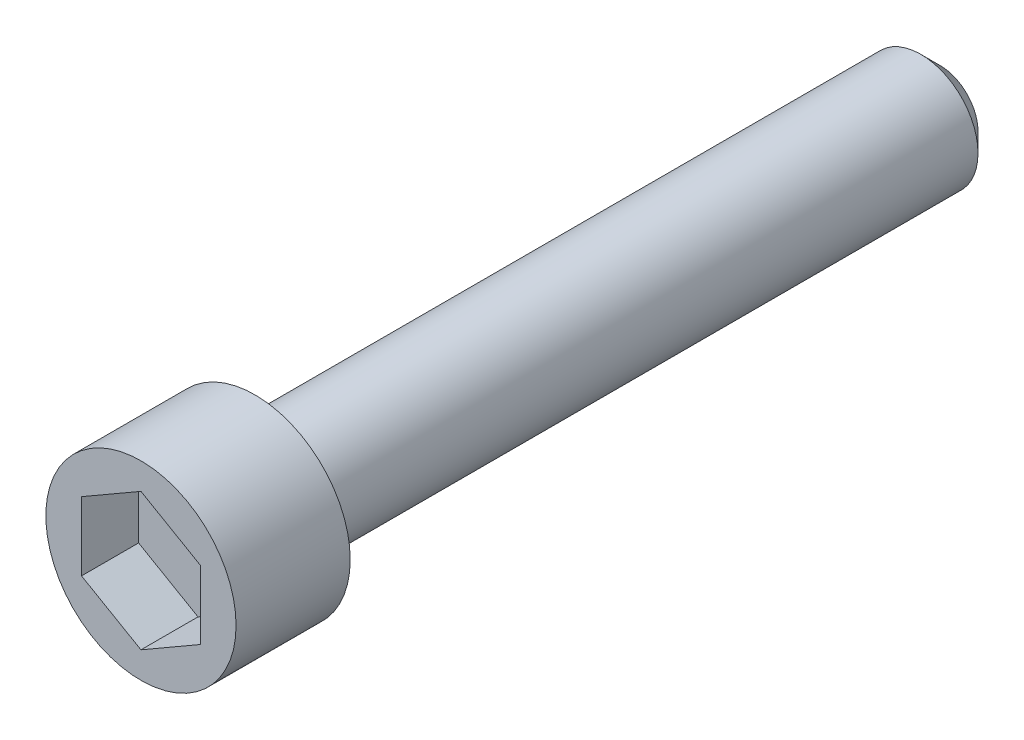
ISO-10303-21;
HEADER;
FILE_DESCRIPTION(('STEP AP214'),'2;1');
FILE_NAME('part.step','',(''),(''),'','','');
FILE_SCHEMA(('AUTOMOTIVE_DESIGN { 1 0 10303 214 1 1 1 1 }'));
ENDSEC;
DATA;
#1=APPLICATION_CONTEXT('core data for automotive mechanical design processes');
#2=APPLICATION_PROTOCOL_DEFINITION('international standard','automotive_design',2000,#1);
#3=PRODUCT_CONTEXT('',#1,'mechanical');
#4=PRODUCT('Part','Part','',(#3));
#5=PRODUCT_RELATED_PRODUCT_CATEGORY('part','',(#4));
#6=PRODUCT_DEFINITION_FORMATION('','',#4);
#7=PRODUCT_DEFINITION_CONTEXT('part definition',#1,'design');
#8=PRODUCT_DEFINITION('design','',#6,#7);
#9=PRODUCT_DEFINITION_SHAPE('','',#8);
#10=(LENGTH_UNIT() NAMED_UNIT(*) SI_UNIT(.MILLI.,.METRE.));
#11=(NAMED_UNIT(*) PLANE_ANGLE_UNIT() SI_UNIT($,.RADIAN.));
#12=(NAMED_UNIT(*) SI_UNIT($,.STERADIAN.) SOLID_ANGLE_UNIT());
#13=UNCERTAINTY_MEASURE_WITH_UNIT(LENGTH_MEASURE(1.E-05),#10,'distance_accuracy_value','');
#14=(GEOMETRIC_REPRESENTATION_CONTEXT(3) GLOBAL_UNCERTAINTY_ASSIGNED_CONTEXT((#13)) GLOBAL_UNIT_ASSIGNED_CONTEXT((#10,
#11,#12)) REPRESENTATION_CONTEXT('',''));
#15=CARTESIAN_POINT('',(0.,0.,0.));
#16=DIRECTION('',(0.,0.,1.));
#17=DIRECTION('',(1.,0.,0.));
#18=AXIS2_PLACEMENT_3D('',#15,#16,#17);
#19=CARTESIAN_POINT('',(0.,0.,18.));
#20=DIRECTION('',(0.,0.,-1.));
#21=DIRECTION('',(-1.,0.,0.));
#22=AXIS2_PLACEMENT_3D('',#19,#20,#21);
#23=CYLINDRICAL_SURFACE('',#22,1.5);
#24=CARTESIAN_POINT('',(0.,0.,0.499999999999997));
#25=DIRECTION('',(0.,0.,1.));
#26=DIRECTION('',(1.,0.,0.));
#27=AXIS2_PLACEMENT_3D('',#24,#25,#26);
#28=CIRCLE('',#27,1.5);
#29=CARTESIAN_POINT('',(1.5,0.,0.499999999999997));
#30=VERTEX_POINT('',#29);
#31=EDGE_CURVE('E44',#30,#30,#28,.T.);
#32=ORIENTED_EDGE('',*,*,#31,.T.);
#33=EDGE_LOOP('',(#32));
#34=FACE_BOUND('',#33,.T.);
#35=CARTESIAN_POINT('',(0.,0.,18.));
#36=DIRECTION('',(0.,0.,1.));
#37=DIRECTION('',(1.,0.,0.));
#38=AXIS2_PLACEMENT_3D('',#35,#36,#37);
#39=CIRCLE('',#38,1.5);
#40=CARTESIAN_POINT('',(1.5,0.,18.));
#41=VERTEX_POINT('',#40);
#42=EDGE_CURVE('E147',#41,#41,#39,.T.);
#43=ORIENTED_EDGE('',*,*,#42,.F.);
#44=EDGE_LOOP('',(#43));
#45=FACE_BOUND('',#44,.T.);
#46=ADVANCED_FACE('F36',(#34,#45),#23,.T.);
#47=CARTESIAN_POINT('',(0.,0.,0.));
#48=DIRECTION('',(0.,0.,1.));
#49=DIRECTION('',(1.,0.,0.));
#50=AXIS2_PLACEMENT_3D('',#47,#48,#49);
#51=PLANE('',#50);
#52=CARTESIAN_POINT('',(0.,0.,0.));
#53=DIRECTION('',(0.,0.,1.));
#54=DIRECTION('',(1.,0.,0.));
#55=AXIS2_PLACEMENT_3D('',#52,#53,#54);
#56=CIRCLE('',#55,1.);
#57=CARTESIAN_POINT('',(1.,0.,0.));
#58=VERTEX_POINT('',#57);
#59=EDGE_CURVE('E11',#58,#58,#56,.F.);
#60=ORIENTED_EDGE('',*,*,#59,.T.);
#61=EDGE_LOOP('',(#60));
#62=FACE_BOUND('',#61,.T.);
#63=ADVANCED_FACE('F165',(#62),#51,.F.);
#64=CARTESIAN_POINT('',(0.,0.,21.));
#65=DIRECTION('',(0.,0.,-1.));
#66=DIRECTION('',(-1.,0.,0.));
#67=AXIS2_PLACEMENT_3D('',#64,#65,#66);
#68=CYLINDRICAL_SURFACE('',#67,2.5);
#69=CARTESIAN_POINT('',(0.,0.,21.));
#70=DIRECTION('',(0.,0.,1.));
#71=DIRECTION('',(1.,0.,0.));
#72=AXIS2_PLACEMENT_3D('',#69,#70,#71);
#73=CIRCLE('',#72,2.5);
#74=CARTESIAN_POINT('',(2.5,0.,21.));
#75=VERTEX_POINT('',#74);
#76=EDGE_CURVE('E144',#75,#75,#73,.T.);
#77=ORIENTED_EDGE('',*,*,#76,.F.);
#78=EDGE_LOOP('',(#77));
#79=FACE_BOUND('',#78,.T.);
#80=CARTESIAN_POINT('',(0.,0.,18.));
#81=DIRECTION('',(0.,0.,1.));
#82=DIRECTION('',(1.,0.,0.));
#83=AXIS2_PLACEMENT_3D('',#80,#81,#82);
#84=CIRCLE('',#83,2.5);
#85=CARTESIAN_POINT('',(2.5,0.,18.));
#86=VERTEX_POINT('',#85);
#87=EDGE_CURVE('E138',#86,#86,#84,.T.);
#88=ORIENTED_EDGE('',*,*,#87,.T.);
#89=EDGE_LOOP('',(#88));
#90=FACE_BOUND('',#89,.T.);
#91=ADVANCED_FACE('F169',(#79,#90),#68,.T.);
#92=CARTESIAN_POINT('',(0.,0.,21.));
#93=DIRECTION('',(0.,0.,1.));
#94=DIRECTION('',(1.,0.,0.));
#95=AXIS2_PLACEMENT_3D('',#92,#93,#94);
#96=PLANE('',#95);
#97=DIRECTION('',(-0.866025403784442,0.499999999999995,0.));
#98=VECTOR('',#97,1.);
#99=CARTESIAN_POINT('',(1.56177486979958,0.901691141492407,21.));
#100=LINE('',#99,#98);
#101=CARTESIAN_POINT('',(1.56177486979958,0.901691141492407,21.));
#102=VERTEX_POINT('',#101);
#103=CARTESIAN_POINT('',(0.,1.80338228298478,21.));
#104=VERTEX_POINT('',#103);
#105=EDGE_CURVE('E51',#102,#104,#100,.T.);
#106=ORIENTED_EDGE('',*,*,#105,.F.);
#107=DIRECTION('',(0.,1.,0.));
#108=VECTOR('',#107,1.);
#109=CARTESIAN_POINT('',(1.5617748697996,-0.901691141492374,21.));
#110=LINE('',#109,#108);
#111=CARTESIAN_POINT('',(1.5617748697996,-0.901691141492374,21.));
#112=VERTEX_POINT('',#111);
#113=EDGE_CURVE('E134',#112,#102,#110,.T.);
#114=ORIENTED_EDGE('',*,*,#113,.F.);
#115=DIRECTION('',(0.866025403784435,0.500000000000007,0.));
#116=VECTOR('',#115,1.);
#117=CARTESIAN_POINT('',(0.,-1.80338228298478,21.));
#118=LINE('',#117,#116);
#119=CARTESIAN_POINT('',(0.,-1.80338228298478,21.));
#120=VERTEX_POINT('',#119);
#121=EDGE_CURVE('E132',#120,#112,#118,.T.);
#122=ORIENTED_EDGE('',*,*,#121,.F.);
#123=DIRECTION('',(0.866025403784441,-0.499999999999995,0.));
#124=VECTOR('',#123,1.);
#125=CARTESIAN_POINT('',(-1.56177486979959,-0.901691141492395,21.));
#126=LINE('',#125,#124);
#127=CARTESIAN_POINT('',(-1.56177486979959,-0.901691141492395,21.));
#128=VERTEX_POINT('',#127);
#129=EDGE_CURVE('E99',#128,#120,#126,.T.);
#130=ORIENTED_EDGE('',*,*,#129,.F.);
#131=DIRECTION('',(0.,-1.,0.));
#132=VECTOR('',#131,1.);
#133=CARTESIAN_POINT('',(-1.5617748697996,0.901691141492385,21.));
#134=LINE('',#133,#132);
#135=CARTESIAN_POINT('',(-1.5617748697996,0.901691141492385,21.));
#136=VERTEX_POINT('',#135);
#137=EDGE_CURVE('E128',#136,#128,#134,.T.);
#138=ORIENTED_EDGE('',*,*,#137,.F.);
#139=DIRECTION('',(-0.866025403784438,-0.500000000000001,0.));
#140=VECTOR('',#139,1.);
#141=CARTESIAN_POINT('',(0.,1.80338228298478,21.));
#142=LINE('',#141,#140);
#143=EDGE_CURVE('E125',#104,#136,#142,.T.);
#144=ORIENTED_EDGE('',*,*,#143,.F.);
#145=EDGE_LOOP('',(#106,#114,#122,#130,#138,#144));
#146=FACE_BOUND('',#145,.T.);
#147=ORIENTED_EDGE('',*,*,#76,.T.);
#148=EDGE_LOOP('',(#147));
#149=FACE_BOUND('',#148,.T.);
#150=ADVANCED_FACE('F175',(#146,#149),#96,.T.);
#151=CARTESIAN_POINT('',(0.,0.,18.));
#152=DIRECTION('',(0.,0.,1.));
#153=DIRECTION('',(1.,0.,0.));
#154=AXIS2_PLACEMENT_3D('',#151,#152,#153);
#155=PLANE('',#154);
#156=ORIENTED_EDGE('',*,*,#42,.T.);
#157=EDGE_LOOP('',(#156));
#158=FACE_BOUND('',#157,.T.);
#159=ORIENTED_EDGE('',*,*,#87,.F.);
#160=EDGE_LOOP('',(#159));
#161=FACE_BOUND('',#160,.T.);
#162=ADVANCED_FACE('F177',(#158,#161),#155,.F.);
#163=CARTESIAN_POINT('',(1.56177486979958,0.901691141492407,19.5));
#164=DIRECTION('',(0.499999999999995,0.866025403784441,0.));
#165=DIRECTION('',(-0.866025403784442,0.499999999999995,0.));
#166=AXIS2_PLACEMENT_3D('',#163,#164,#165);
#167=PLANE('',#166);
#168=ORIENTED_EDGE('',*,*,#105,.T.);
#169=DIRECTION('',(0.,0.,1.));
#170=VECTOR('',#169,1.);
#171=CARTESIAN_POINT('',(0.,1.80338228298478,19.5));
#172=LINE('',#171,#170);
#173=CARTESIAN_POINT('',(0.,1.80338228298478,19.5));
#174=VERTEX_POINT('',#173);
#175=EDGE_CURVE('E81',#174,#104,#172,.T.);
#176=ORIENTED_EDGE('',*,*,#175,.F.);
#177=DIRECTION('',(-0.866025403784442,0.499999999999995,0.));
#178=VECTOR('',#177,1.);
#179=CARTESIAN_POINT('',(1.56177486979958,0.901691141492407,19.5));
#180=LINE('',#179,#178);
#181=CARTESIAN_POINT('',(1.56177486979958,0.901691141492407,19.5));
#182=VERTEX_POINT('',#181);
#183=EDGE_CURVE('E136',#182,#174,#180,.T.);
#184=ORIENTED_EDGE('',*,*,#183,.F.);
#185=DIRECTION('',(0.,0.,1.));
#186=VECTOR('',#185,1.);
#187=CARTESIAN_POINT('',(1.56177486979958,0.901691141492407,19.5));
#188=LINE('',#187,#186);
#189=EDGE_CURVE('E59',#182,#102,#188,.T.);
#190=ORIENTED_EDGE('',*,*,#189,.T.);
#191=EDGE_LOOP('',(#168,#176,#184,#190));
#192=FACE_BOUND('',#191,.T.);
#193=ADVANCED_FACE('F180',(#192),#167,.F.);
#194=CARTESIAN_POINT('',(1.5617748697996,-0.901691141492374,19.5));
#195=DIRECTION('',(1.,0.,0.));
#196=DIRECTION('',(0.,1.,0.));
#197=AXIS2_PLACEMENT_3D('',#194,#195,#196);
#198=PLANE('',#197);
#199=ORIENTED_EDGE('',*,*,#113,.T.);
#200=ORIENTED_EDGE('',*,*,#189,.F.);
#201=DIRECTION('',(0.,1.,0.));
#202=VECTOR('',#201,1.);
#203=CARTESIAN_POINT('',(1.5617748697996,-0.901691141492374,19.5));
#204=LINE('',#203,#202);
#205=CARTESIAN_POINT('',(1.5617748697996,-0.901691141492374,19.5));
#206=VERTEX_POINT('',#205);
#207=EDGE_CURVE('E111',#206,#182,#204,.T.);
#208=ORIENTED_EDGE('',*,*,#207,.F.);
#209=DIRECTION('',(0.,0.,1.));
#210=VECTOR('',#209,1.);
#211=CARTESIAN_POINT('',(1.5617748697996,-0.901691141492374,19.5));
#212=LINE('',#211,#210);
#213=EDGE_CURVE('E103',#206,#112,#212,.T.);
#214=ORIENTED_EDGE('',*,*,#213,.T.);
#215=EDGE_LOOP('',(#199,#200,#208,#214));
#216=FACE_BOUND('',#215,.T.);
#217=ADVANCED_FACE('F187',(#216),#198,.F.);
#218=CARTESIAN_POINT('',(0.,-1.80338228298478,19.5));
#219=DIRECTION('',(0.500000000000007,-0.866025403784435,0.));
#220=DIRECTION('',(0.866025403784434,0.500000000000007,0.));
#221=AXIS2_PLACEMENT_3D('',#218,#219,#220);
#222=PLANE('',#221);
#223=ORIENTED_EDGE('',*,*,#121,.T.);
#224=ORIENTED_EDGE('',*,*,#213,.F.);
#225=DIRECTION('',(0.866025403784435,0.500000000000007,0.));
#226=VECTOR('',#225,1.);
#227=CARTESIAN_POINT('',(0.,-1.80338228298478,19.5));
#228=LINE('',#227,#226);
#229=CARTESIAN_POINT('',(0.,-1.80338228298478,19.5));
#230=VERTEX_POINT('',#229);
#231=EDGE_CURVE('E107',#230,#206,#228,.T.);
#232=ORIENTED_EDGE('',*,*,#231,.F.);
#233=DIRECTION('',(0.,0.,1.));
#234=VECTOR('',#233,1.);
#235=CARTESIAN_POINT('',(0.,-1.80338228298478,19.5));
#236=LINE('',#235,#234);
#237=EDGE_CURVE('E92',#230,#120,#236,.T.);
#238=ORIENTED_EDGE('',*,*,#237,.T.);
#239=EDGE_LOOP('',(#223,#224,#232,#238));
#240=FACE_BOUND('',#239,.T.);
#241=ADVANCED_FACE('F108',(#240),#222,.F.);
#242=CARTESIAN_POINT('',(-1.56177486979959,-0.901691141492395,19.5));
#243=DIRECTION('',(-0.499999999999995,-0.866025403784441,0.));
#244=DIRECTION('',(0.866025403784442,-0.499999999999995,0.));
#245=AXIS2_PLACEMENT_3D('',#242,#243,#244);
#246=PLANE('',#245);
#247=ORIENTED_EDGE('',*,*,#129,.T.);
#248=ORIENTED_EDGE('',*,*,#237,.F.);
#249=DIRECTION('',(0.866025403784441,-0.499999999999995,0.));
#250=VECTOR('',#249,1.);
#251=CARTESIAN_POINT('',(-1.56177486979959,-0.901691141492395,19.5));
#252=LINE('',#251,#250);
#253=CARTESIAN_POINT('',(-1.56177486979959,-0.901691141492395,19.5));
#254=VERTEX_POINT('',#253);
#255=EDGE_CURVE('E96',#254,#230,#252,.T.);
#256=ORIENTED_EDGE('',*,*,#255,.F.);
#257=DIRECTION('',(0.,0.,1.));
#258=VECTOR('',#257,1.);
#259=CARTESIAN_POINT('',(-1.56177486979959,-0.901691141492395,19.5));
#260=LINE('',#259,#258);
#261=EDGE_CURVE('E104',#254,#128,#260,.T.);
#262=ORIENTED_EDGE('',*,*,#261,.T.);
#263=EDGE_LOOP('',(#247,#248,#256,#262));
#264=FACE_BOUND('',#263,.T.);
#265=ADVANCED_FACE('F94',(#264),#246,.F.);
#266=CARTESIAN_POINT('',(-1.5617748697996,0.901691141492385,19.5));
#267=DIRECTION('',(-1.,0.,0.));
#268=DIRECTION('',(0.,-1.,0.));
#269=AXIS2_PLACEMENT_3D('',#266,#267,#268);
#270=PLANE('',#269);
#271=ORIENTED_EDGE('',*,*,#137,.T.);
#272=ORIENTED_EDGE('',*,*,#261,.F.);
#273=DIRECTION('',(0.,-1.,0.));
#274=VECTOR('',#273,1.);
#275=CARTESIAN_POINT('',(-1.5617748697996,0.901691141492385,19.5));
#276=LINE('',#275,#274);
#277=CARTESIAN_POINT('',(-1.5617748697996,0.901691141492385,19.5));
#278=VERTEX_POINT('',#277);
#279=EDGE_CURVE('E117',#278,#254,#276,.T.);
#280=ORIENTED_EDGE('',*,*,#279,.F.);
#281=DIRECTION('',(0.,0.,1.));
#282=VECTOR('',#281,1.);
#283=CARTESIAN_POINT('',(-1.5617748697996,0.901691141492385,19.5));
#284=LINE('',#283,#282);
#285=EDGE_CURVE('E141',#278,#136,#284,.T.);
#286=ORIENTED_EDGE('',*,*,#285,.T.);
#287=EDGE_LOOP('',(#271,#272,#280,#286));
#288=FACE_BOUND('',#287,.T.);
#289=ADVANCED_FACE('F190',(#288),#270,.F.);
#290=CARTESIAN_POINT('',(0.,1.80338228298478,19.5));
#291=DIRECTION('',(-0.500000000000001,0.866025403784438,0.));
#292=DIRECTION('',(-0.866025403784438,-0.500000000000001,0.));
#293=AXIS2_PLACEMENT_3D('',#290,#291,#292);
#294=PLANE('',#293);
#295=ORIENTED_EDGE('',*,*,#143,.T.);
#296=ORIENTED_EDGE('',*,*,#285,.F.);
#297=DIRECTION('',(-0.866025403784438,-0.500000000000001,0.));
#298=VECTOR('',#297,1.);
#299=CARTESIAN_POINT('',(0.,1.80338228298478,19.5));
#300=LINE('',#299,#298);
#301=EDGE_CURVE('E119',#174,#278,#300,.T.);
#302=ORIENTED_EDGE('',*,*,#301,.F.);
#303=ORIENTED_EDGE('',*,*,#175,.T.);
#304=EDGE_LOOP('',(#295,#296,#302,#303));
#305=FACE_BOUND('',#304,.T.);
#306=ADVANCED_FACE('F161',(#305),#294,.F.);
#307=CARTESIAN_POINT('',(0.,0.,19.5));
#308=DIRECTION('',(0.,0.,1.));
#309=DIRECTION('',(1.,0.,0.));
#310=AXIS2_PLACEMENT_3D('',#307,#308,#309);
#311=PLANE('',#310);
#312=ORIENTED_EDGE('',*,*,#183,.T.);
#313=ORIENTED_EDGE('',*,*,#301,.T.);
#314=ORIENTED_EDGE('',*,*,#279,.T.);
#315=ORIENTED_EDGE('',*,*,#255,.T.);
#316=ORIENTED_EDGE('',*,*,#231,.T.);
#317=ORIENTED_EDGE('',*,*,#207,.T.);
#318=EDGE_LOOP('',(#312,#313,#314,#315,#316,#317));
#319=FACE_BOUND('',#318,.T.);
#320=ADVANCED_FACE('F114',(#319),#311,.T.);
#321=CARTESIAN_POINT('',(0.,0.,0.499999999999997));
#322=DIRECTION('',(0.,0.,1.));
#323=DIRECTION('',(1.,0.,0.));
#324=AXIS2_PLACEMENT_3D('',#321,#322,#323);
#325=CONICAL_SURFACE('',#324,1.5,0.78539816339745);
#326=ORIENTED_EDGE('',*,*,#59,.F.);
#327=EDGE_LOOP('',(#326));
#328=FACE_BOUND('',#327,.T.);
#329=ORIENTED_EDGE('',*,*,#31,.F.);
#330=EDGE_LOOP('',(#329));
#331=FACE_BOUND('',#330,.T.);
#332=ADVANCED_FACE('F38',(#328,#331),#325,.T.);
#333=CLOSED_SHELL('',(#46,#63,#91,#150,#162,#193,#217,#241,#265,#289,#306,#320,#332));
#334=MANIFOLD_SOLID_BREP('B2',#333);
#335=ADVANCED_BREP_SHAPE_REPRESENTATION('',(#18,#334),#14);
#336=SHAPE_DEFINITION_REPRESENTATION(#9,#335);
ENDSEC;
END-ISO-10303-21;
